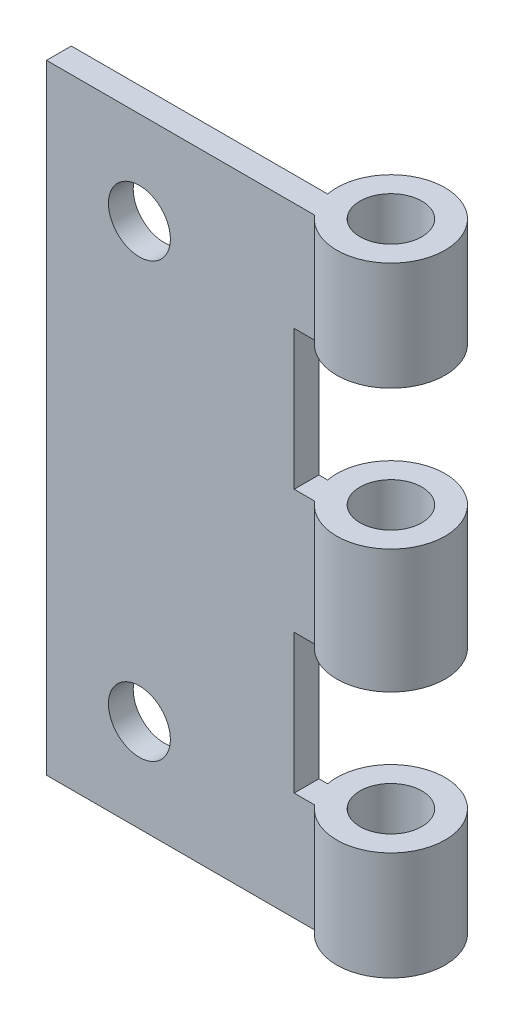
ISO-10303-21;
HEADER;
FILE_DESCRIPTION(('STEP AP214'),'2;1');
FILE_NAME('part.step','',(''),(''),'','','');
FILE_SCHEMA(('AUTOMOTIVE_DESIGN { 1 0 10303 214 1 1 1 1 }'));
ENDSEC;
DATA;
#1=APPLICATION_CONTEXT('core data for automotive mechanical design processes');
#2=APPLICATION_PROTOCOL_DEFINITION('international standard','automotive_design',2000,#1);
#3=PRODUCT_CONTEXT('',#1,'mechanical');
#4=PRODUCT('Part','Part','',(#3));
#5=PRODUCT_RELATED_PRODUCT_CATEGORY('part','',(#4));
#6=PRODUCT_DEFINITION_FORMATION('','',#4);
#7=PRODUCT_DEFINITION_CONTEXT('part definition',#1,'design');
#8=PRODUCT_DEFINITION('design','',#6,#7);
#9=PRODUCT_DEFINITION_SHAPE('','',#8);
#10=(LENGTH_UNIT() NAMED_UNIT(*) SI_UNIT(.MILLI.,.METRE.));
#11=(NAMED_UNIT(*) PLANE_ANGLE_UNIT() SI_UNIT($,.RADIAN.));
#12=(NAMED_UNIT(*) SI_UNIT($,.STERADIAN.) SOLID_ANGLE_UNIT());
#13=UNCERTAINTY_MEASURE_WITH_UNIT(LENGTH_MEASURE(1.E-05),#10,'distance_accuracy_value','');
#14=(GEOMETRIC_REPRESENTATION_CONTEXT(3) GLOBAL_UNCERTAINTY_ASSIGNED_CONTEXT((#13)) GLOBAL_UNIT_ASSIGNED_CONTEXT((#10,
#11,#12)) REPRESENTATION_CONTEXT('',''));
#15=CARTESIAN_POINT('',(0.,0.,0.));
#16=DIRECTION('',(0.,0.,1.));
#17=DIRECTION('',(1.,0.,0.));
#18=AXIS2_PLACEMENT_3D('',#15,#16,#17);
#19=CARTESIAN_POINT('',(25.4,50.8,-2.85750000000001));
#20=DIRECTION('',(0.,-1.,0.));
#21=DIRECTION('',(0.,0.,-1.));
#22=AXIS2_PLACEMENT_3D('',#19,#20,#21);
#23=CYLINDRICAL_SURFACE('',#22,4.44499999999999);
#24=CARTESIAN_POINT('',(25.4,30.48,-2.85750000000001));
#25=DIRECTION('',(0.,1.,0.));
#26=DIRECTION('',(0.,0.,1.));
#27=AXIS2_PLACEMENT_3D('',#24,#25,#26);
#28=CIRCLE('',#27,4.44499999999999);
#29=CARTESIAN_POINT('',(21.9951918189126,30.48,0.));
#30=VERTEX_POINT('',#29);
#31=CARTESIAN_POINT('',(21.0323261625895,30.48,-2.032));
#32=VERTEX_POINT('',#31);
#33=EDGE_CURVE('E50',#30,#32,#28,.T.);
#34=ORIENTED_EDGE('',*,*,#33,.F.);
#35=DIRECTION('',(0.,-1.,0.));
#36=VECTOR('',#35,1.);
#37=CARTESIAN_POINT('',(21.9951918189126,50.8,0.));
#38=LINE('',#37,#36);
#39=CARTESIAN_POINT('',(21.9951918189126,20.32,0.));
#40=VERTEX_POINT('',#39);
#41=EDGE_CURVE('E42',#30,#40,#38,.T.);
#42=ORIENTED_EDGE('',*,*,#41,.T.);
#43=CARTESIAN_POINT('',(25.4,20.32,-2.85750000000001));
#44=DIRECTION('',(0.,1.,0.));
#45=DIRECTION('',(0.,0.,1.));
#46=AXIS2_PLACEMENT_3D('',#43,#44,#45);
#47=CIRCLE('',#46,4.44499999999999);
#48=CARTESIAN_POINT('',(21.0323261625895,20.32,-2.032));
#49=VERTEX_POINT('',#48);
#50=EDGE_CURVE('E213',#40,#49,#47,.T.);
#51=ORIENTED_EDGE('',*,*,#50,.T.);
#52=DIRECTION('',(0.,-1.,0.));
#53=VECTOR('',#52,1.);
#54=CARTESIAN_POINT('',(21.0323261625895,50.8,-2.032));
#55=LINE('',#54,#53);
#56=EDGE_CURVE('E147',#32,#49,#55,.T.);
#57=ORIENTED_EDGE('',*,*,#56,.F.);
#58=EDGE_LOOP('',(#34,#42,#51,#57));
#59=FACE_BOUND('',#58,.T.);
#60=ADVANCED_FACE('F33',(#59),#23,.T.);
#61=CARTESIAN_POINT('',(25.4,8.89,-2.85750000000001));
#62=DIRECTION('',(0.,1.,0.));
#63=DIRECTION('',(0.,0.,1.));
#64=AXIS2_PLACEMENT_3D('',#61,#62,#63);
#65=CIRCLE('',#64,4.44499999999999);
#66=CARTESIAN_POINT('',(21.9951918189126,8.89,0.));
#67=VERTEX_POINT('',#66);
#68=CARTESIAN_POINT('',(21.0323261625895,8.89,-2.032));
#69=VERTEX_POINT('',#68);
#70=EDGE_CURVE('E58',#67,#69,#65,.T.);
#71=ORIENTED_EDGE('',*,*,#70,.F.);
#72=CARTESIAN_POINT('',(21.9951918189126,0.,0.));
#73=VERTEX_POINT('',#72);
#74=EDGE_CURVE('E43',#67,#73,#38,.T.);
#75=ORIENTED_EDGE('',*,*,#74,.T.);
#76=CARTESIAN_POINT('',(25.4,0.,-2.85750000000001));
#77=DIRECTION('',(0.,1.,0.));
#78=DIRECTION('',(0.,0.,1.));
#79=AXIS2_PLACEMENT_3D('',#76,#77,#78);
#80=CIRCLE('',#79,4.44499999999999);
#81=CARTESIAN_POINT('',(21.0323261625895,0.,-2.032));
#82=VERTEX_POINT('',#81);
#83=EDGE_CURVE('E169',#73,#82,#80,.T.);
#84=ORIENTED_EDGE('',*,*,#83,.T.);
#85=EDGE_CURVE('E149',#69,#82,#55,.T.);
#86=ORIENTED_EDGE('',*,*,#85,.F.);
#87=EDGE_LOOP('',(#71,#75,#84,#86));
#88=FACE_BOUND('',#87,.T.);
#89=ADVANCED_FACE('F268',(#88),#23,.T.);
#90=CARTESIAN_POINT('',(-9.0853298966291,50.8,0.));
#91=DIRECTION('',(0.,0.,-1.));
#92=DIRECTION('',(-1.,0.,0.));
#93=AXIS2_PLACEMENT_3D('',#90,#91,#92);
#94=PLANE('',#93);
#95=CARTESIAN_POINT('',(7.62,7.62,0.));
#96=DIRECTION('',(0.,0.,-1.));
#97=DIRECTION('',(-1.,0.,0.));
#98=AXIS2_PLACEMENT_3D('',#95,#96,#97);
#99=CIRCLE('',#98,2.54);
#100=CARTESIAN_POINT('',(5.08,7.62,0.));
#101=VERTEX_POINT('',#100);
#102=EDGE_CURVE('E186',#101,#101,#99,.T.);
#103=ORIENTED_EDGE('',*,*,#102,.T.);
#104=EDGE_LOOP('',(#103));
#105=FACE_BOUND('',#104,.T.);
#106=CARTESIAN_POINT('',(7.62,43.18,0.));
#107=DIRECTION('',(0.,0.,-1.));
#108=DIRECTION('',(-1.,0.,0.));
#109=AXIS2_PLACEMENT_3D('',#106,#107,#108);
#110=CIRCLE('',#109,2.54000000000001);
#111=CARTESIAN_POINT('',(5.07999999999999,43.18,0.));
#112=VERTEX_POINT('',#111);
#113=EDGE_CURVE('E174',#112,#112,#110,.T.);
#114=ORIENTED_EDGE('',*,*,#113,.T.);
#115=EDGE_LOOP('',(#114));
#116=FACE_BOUND('',#115,.T.);
#117=DIRECTION('',(0.,-1.,0.));
#118=VECTOR('',#117,1.);
#119=CARTESIAN_POINT('',(20.32,41.91,0.));
#120=LINE('',#119,#118);
#121=CARTESIAN_POINT('',(20.32,41.91,0.));
#122=VERTEX_POINT('',#121);
#123=CARTESIAN_POINT('',(20.32,30.48,0.));
#124=VERTEX_POINT('',#123);
#125=EDGE_CURVE('E219',#122,#124,#120,.T.);
#126=ORIENTED_EDGE('',*,*,#125,.F.);
#127=DIRECTION('',(1.,0.,0.));
#128=VECTOR('',#127,1.);
#129=CARTESIAN_POINT('',(-9.0853298966291,41.91,0.));
#130=LINE('',#129,#128);
#131=CARTESIAN_POINT('',(21.9951918189126,41.91,0.));
#132=VERTEX_POINT('',#131);
#133=EDGE_CURVE('E221',#122,#132,#130,.T.);
#134=ORIENTED_EDGE('',*,*,#133,.T.);
#135=CARTESIAN_POINT('',(21.9951918189126,50.8,0.));
#136=VERTEX_POINT('',#135);
#137=EDGE_CURVE('E11',#136,#132,#38,.T.);
#138=ORIENTED_EDGE('',*,*,#137,.F.);
#139=DIRECTION('',(1.,0.,0.));
#140=VECTOR('',#139,1.);
#141=CARTESIAN_POINT('',(-9.0853298966291,50.8,0.));
#142=LINE('',#141,#140);
#143=CARTESIAN_POINT('',(0.,50.8,0.));
#144=VERTEX_POINT('',#143);
#145=EDGE_CURVE('E165',#144,#136,#142,.T.);
#146=ORIENTED_EDGE('',*,*,#145,.F.);
#147=DIRECTION('',(0.,-1.,0.));
#148=VECTOR('',#147,1.);
#149=CARTESIAN_POINT('',(0.,50.8,0.));
#150=LINE('',#149,#148);
#151=CARTESIAN_POINT('',(0.,0.,0.));
#152=VERTEX_POINT('',#151);
#153=EDGE_CURVE('E155',#144,#152,#150,.T.);
#154=ORIENTED_EDGE('',*,*,#153,.T.);
#155=DIRECTION('',(1.,0.,0.));
#156=VECTOR('',#155,1.);
#157=CARTESIAN_POINT('',(-9.0853298966291,0.,0.));
#158=LINE('',#157,#156);
#159=EDGE_CURVE('E171',#152,#73,#158,.T.);
#160=ORIENTED_EDGE('',*,*,#159,.T.);
#161=ORIENTED_EDGE('',*,*,#74,.F.);
#162=DIRECTION('',(1.,0.,0.));
#163=VECTOR('',#162,1.);
#164=CARTESIAN_POINT('',(-9.0853298966291,8.89,0.));
#165=LINE('',#164,#163);
#166=CARTESIAN_POINT('',(20.32,8.89,0.));
#167=VERTEX_POINT('',#166);
#168=EDGE_CURVE('E205',#167,#67,#165,.T.);
#169=ORIENTED_EDGE('',*,*,#168,.F.);
#170=DIRECTION('',(0.,-1.,0.));
#171=VECTOR('',#170,1.);
#172=CARTESIAN_POINT('',(20.32,20.32,0.));
#173=LINE('',#172,#171);
#174=CARTESIAN_POINT('',(20.32,20.32,0.));
#175=VERTEX_POINT('',#174);
#176=EDGE_CURVE('E195',#175,#167,#173,.T.);
#177=ORIENTED_EDGE('',*,*,#176,.F.);
#178=DIRECTION('',(1.,0.,0.));
#179=VECTOR('',#178,1.);
#180=CARTESIAN_POINT('',(-9.0853298966291,20.32,0.));
#181=LINE('',#180,#179);
#182=EDGE_CURVE('E201',#175,#40,#181,.T.);
#183=ORIENTED_EDGE('',*,*,#182,.T.);
#184=ORIENTED_EDGE('',*,*,#41,.F.);
#185=DIRECTION('',(1.,0.,0.));
#186=VECTOR('',#185,1.);
#187=CARTESIAN_POINT('',(-9.0853298966291,30.48,0.));
#188=LINE('',#187,#186);
#189=EDGE_CURVE('E141',#124,#30,#188,.T.);
#190=ORIENTED_EDGE('',*,*,#189,.F.);
#191=EDGE_LOOP('',(#126,#134,#138,#146,#154,#160,#161,#169,#177,#183,#184,#190));
#192=FACE_BOUND('',#191,.T.);
#193=ADVANCED_FACE('F35',(#105,#116,#192),#94,.F.);
#194=ORIENTED_EDGE('',*,*,#137,.T.);
#195=CARTESIAN_POINT('',(25.4,41.91,-2.85750000000001));
#196=DIRECTION('',(0.,1.,0.));
#197=DIRECTION('',(0.,0.,1.));
#198=AXIS2_PLACEMENT_3D('',#195,#196,#197);
#199=CIRCLE('',#198,4.44499999999999);
#200=CARTESIAN_POINT('',(21.0323261625895,41.91,-2.032));
#201=VERTEX_POINT('',#200);
#202=EDGE_CURVE('E127',#132,#201,#199,.T.);
#203=ORIENTED_EDGE('',*,*,#202,.T.);
#204=CARTESIAN_POINT('',(21.0323261625895,50.8,-2.032));
#205=VERTEX_POINT('',#204);
#206=EDGE_CURVE('E138',#205,#201,#55,.T.);
#207=ORIENTED_EDGE('',*,*,#206,.F.);
#208=CARTESIAN_POINT('',(25.4,50.8,-2.85750000000001));
#209=DIRECTION('',(0.,1.,0.));
#210=DIRECTION('',(0.,0.,1.));
#211=AXIS2_PLACEMENT_3D('',#208,#209,#210);
#212=CIRCLE('',#211,4.44499999999999);
#213=EDGE_CURVE('E177',#136,#205,#212,.T.);
#214=ORIENTED_EDGE('',*,*,#213,.F.);
#215=EDGE_LOOP('',(#194,#203,#207,#214));
#216=FACE_BOUND('',#215,.T.);
#217=ADVANCED_FACE('F137',(#216),#23,.T.);
#218=CARTESIAN_POINT('',(-9.0853298966291,50.8,-2.032));
#219=DIRECTION('',(0.,0.,-1.));
#220=DIRECTION('',(-1.,0.,0.));
#221=AXIS2_PLACEMENT_3D('',#218,#219,#220);
#222=PLANE('',#221);
#223=DIRECTION('',(1.,0.,0.));
#224=VECTOR('',#223,1.);
#225=CARTESIAN_POINT('',(-9.0853298966291,41.91,-2.032));
#226=LINE('',#225,#224);
#227=CARTESIAN_POINT('',(20.32,41.91,-2.032));
#228=VERTEX_POINT('',#227);
#229=EDGE_CURVE('E124',#228,#201,#226,.T.);
#230=ORIENTED_EDGE('',*,*,#229,.F.);
#231=DIRECTION('',(0.,-1.,0.));
#232=VECTOR('',#231,1.);
#233=CARTESIAN_POINT('',(20.32,41.91,-2.032));
#234=LINE('',#233,#232);
#235=CARTESIAN_POINT('',(20.32,30.48,-2.032));
#236=VERTEX_POINT('',#235);
#237=EDGE_CURVE('E207',#228,#236,#234,.T.);
#238=ORIENTED_EDGE('',*,*,#237,.T.);
#239=DIRECTION('',(1.,0.,0.));
#240=VECTOR('',#239,1.);
#241=CARTESIAN_POINT('',(-9.0853298966291,30.48,-2.032));
#242=LINE('',#241,#240);
#243=EDGE_CURVE('E226',#236,#32,#242,.T.);
#244=ORIENTED_EDGE('',*,*,#243,.T.);
#245=ORIENTED_EDGE('',*,*,#56,.T.);
#246=DIRECTION('',(1.,0.,0.));
#247=VECTOR('',#246,1.);
#248=CARTESIAN_POINT('',(-9.0853298966291,20.32,-2.032));
#249=LINE('',#248,#247);
#250=CARTESIAN_POINT('',(20.32,20.32,-2.032));
#251=VERTEX_POINT('',#250);
#252=EDGE_CURVE('E210',#251,#49,#249,.T.);
#253=ORIENTED_EDGE('',*,*,#252,.F.);
#254=DIRECTION('',(0.,-1.,0.));
#255=VECTOR('',#254,1.);
#256=CARTESIAN_POINT('',(20.32,20.32,-2.032));
#257=LINE('',#256,#255);
#258=CARTESIAN_POINT('',(20.32,8.89,-2.032));
#259=VERTEX_POINT('',#258);
#260=EDGE_CURVE('E192',#251,#259,#257,.T.);
#261=ORIENTED_EDGE('',*,*,#260,.T.);
#262=DIRECTION('',(1.,0.,0.));
#263=VECTOR('',#262,1.);
#264=CARTESIAN_POINT('',(-9.0853298966291,8.89,-2.032));
#265=LINE('',#264,#263);
#266=EDGE_CURVE('E202',#259,#69,#265,.T.);
#267=ORIENTED_EDGE('',*,*,#266,.T.);
#268=ORIENTED_EDGE('',*,*,#85,.T.);
#269=DIRECTION('',(1.,0.,0.));
#270=VECTOR('',#269,1.);
#271=CARTESIAN_POINT('',(-9.0853298966291,0.,-2.032));
#272=LINE('',#271,#270);
#273=CARTESIAN_POINT('',(0.,0.,-2.032));
#274=VERTEX_POINT('',#273);
#275=EDGE_CURVE('E166',#274,#82,#272,.T.);
#276=ORIENTED_EDGE('',*,*,#275,.F.);
#277=DIRECTION('',(0.,-1.,0.));
#278=VECTOR('',#277,1.);
#279=CARTESIAN_POINT('',(0.,50.8,-2.032));
#280=LINE('',#279,#278);
#281=CARTESIAN_POINT('',(0.,50.8,-2.032));
#282=VERTEX_POINT('',#281);
#283=EDGE_CURVE('E151',#282,#274,#280,.T.);
#284=ORIENTED_EDGE('',*,*,#283,.F.);
#285=DIRECTION('',(1.,0.,0.));
#286=VECTOR('',#285,1.);
#287=CARTESIAN_POINT('',(-9.0853298966291,50.8,-2.032));
#288=LINE('',#287,#286);
#289=EDGE_CURVE('E146',#282,#205,#288,.T.);
#290=ORIENTED_EDGE('',*,*,#289,.T.);
#291=ORIENTED_EDGE('',*,*,#206,.T.);
#292=EDGE_LOOP('',(#230,#238,#244,#245,#253,#261,#267,#268,#276,#284,#290,#291));
#293=FACE_BOUND('',#292,.T.);
#294=CARTESIAN_POINT('',(7.62,7.62,-2.032));
#295=DIRECTION('',(0.,0.,-1.));
#296=DIRECTION('',(-1.,0.,0.));
#297=AXIS2_PLACEMENT_3D('',#294,#295,#296);
#298=CIRCLE('',#297,2.54);
#299=CARTESIAN_POINT('',(5.08,7.62,-2.032));
#300=VERTEX_POINT('',#299);
#301=EDGE_CURVE('E189',#300,#300,#298,.T.);
#302=ORIENTED_EDGE('',*,*,#301,.F.);
#303=EDGE_LOOP('',(#302));
#304=FACE_BOUND('',#303,.T.);
#305=CARTESIAN_POINT('',(7.62,43.18,-2.032));
#306=DIRECTION('',(0.,0.,-1.));
#307=DIRECTION('',(-1.,0.,0.));
#308=AXIS2_PLACEMENT_3D('',#305,#306,#307);
#309=CIRCLE('',#308,2.54000000000001);
#310=CARTESIAN_POINT('',(5.07999999999999,43.18,-2.032));
#311=VERTEX_POINT('',#310);
#312=EDGE_CURVE('E183',#311,#311,#309,.T.);
#313=ORIENTED_EDGE('',*,*,#312,.F.);
#314=EDGE_LOOP('',(#313));
#315=FACE_BOUND('',#314,.T.);
#316=ADVANCED_FACE('F143',(#293,#304,#315),#222,.T.);
#317=CARTESIAN_POINT('',(0.,50.8,-1.60470923574486));
#318=DIRECTION('',(-1.,0.,0.));
#319=DIRECTION('',(0.,0.,1.));
#320=AXIS2_PLACEMENT_3D('',#317,#318,#319);
#321=PLANE('',#320);
#322=DIRECTION('',(0.,0.,-1.));
#323=VECTOR('',#322,1.);
#324=CARTESIAN_POINT('',(0.,0.,-1.60470923574486));
#325=LINE('',#324,#323);
#326=EDGE_CURVE('E162',#152,#274,#325,.T.);
#327=ORIENTED_EDGE('',*,*,#326,.F.);
#328=ORIENTED_EDGE('',*,*,#153,.F.);
#329=DIRECTION('',(0.,0.,-1.));
#330=VECTOR('',#329,1.);
#331=CARTESIAN_POINT('',(0.,50.8,-1.60470923574486));
#332=LINE('',#331,#330);
#333=EDGE_CURVE('E159',#144,#282,#332,.T.);
#334=ORIENTED_EDGE('',*,*,#333,.T.);
#335=ORIENTED_EDGE('',*,*,#283,.T.);
#336=EDGE_LOOP('',(#327,#328,#334,#335));
#337=FACE_BOUND('',#336,.T.);
#338=ADVANCED_FACE('F280',(#337),#321,.T.);
#339=CARTESIAN_POINT('',(-9.0853298966291,50.8,-1.60470923574486));
#340=DIRECTION('',(0.,1.,0.));
#341=DIRECTION('',(0.,0.,1.));
#342=AXIS2_PLACEMENT_3D('',#339,#340,#341);
#343=PLANE('',#342);
#344=CARTESIAN_POINT('',(25.4,50.8,-2.85750000000001));
#345=DIRECTION('',(0.,1.,0.));
#346=DIRECTION('',(0.,0.,1.));
#347=AXIS2_PLACEMENT_3D('',#344,#345,#346);
#348=CIRCLE('',#347,2.54);
#349=CARTESIAN_POINT('',(25.4,50.8,-0.31750000000001));
#350=VERTEX_POINT('',#349);
#351=EDGE_CURVE('E240',#350,#350,#348,.T.);
#352=ORIENTED_EDGE('',*,*,#351,.F.);
#353=EDGE_LOOP('',(#352));
#354=FACE_BOUND('',#353,.T.);
#355=ORIENTED_EDGE('',*,*,#145,.T.);
#356=ORIENTED_EDGE('',*,*,#213,.T.);
#357=ORIENTED_EDGE('',*,*,#289,.F.);
#358=ORIENTED_EDGE('',*,*,#333,.F.);
#359=EDGE_LOOP('',(#355,#356,#357,#358));
#360=FACE_BOUND('',#359,.T.);
#361=ADVANCED_FACE('F312',(#354,#360),#343,.T.);
#362=CARTESIAN_POINT('',(-9.0853298966291,0.,-1.60470923574486));
#363=DIRECTION('',(0.,1.,0.));
#364=DIRECTION('',(0.,0.,1.));
#365=AXIS2_PLACEMENT_3D('',#362,#363,#364);
#366=PLANE('',#365);
#367=CARTESIAN_POINT('',(25.4,0.,-2.85750000000001));
#368=DIRECTION('',(0.,1.,0.));
#369=DIRECTION('',(0.,0.,1.));
#370=AXIS2_PLACEMENT_3D('',#367,#368,#369);
#371=CIRCLE('',#370,2.54);
#372=CARTESIAN_POINT('',(25.4,0.,-0.31750000000001));
#373=VERTEX_POINT('',#372);
#374=EDGE_CURVE('E243',#373,#373,#371,.T.);
#375=ORIENTED_EDGE('',*,*,#374,.T.);
#376=EDGE_LOOP('',(#375));
#377=FACE_BOUND('',#376,.T.);
#378=ORIENTED_EDGE('',*,*,#159,.F.);
#379=ORIENTED_EDGE('',*,*,#326,.T.);
#380=ORIENTED_EDGE('',*,*,#275,.T.);
#381=ORIENTED_EDGE('',*,*,#83,.F.);
#382=EDGE_LOOP('',(#378,#379,#380,#381));
#383=FACE_BOUND('',#382,.T.);
#384=ADVANCED_FACE('F309',(#377,#383),#366,.F.);
#385=CARTESIAN_POINT('',(7.62,43.18,48.768));
#386=DIRECTION('',(0.,0.,-1.));
#387=DIRECTION('',(-1.,0.,0.));
#388=AXIS2_PLACEMENT_3D('',#385,#386,#387);
#389=CYLINDRICAL_SURFACE('',#388,2.54000000000001);
#390=ORIENTED_EDGE('',*,*,#312,.T.);
#391=EDGE_LOOP('',(#390));
#392=FACE_BOUND('',#391,.T.);
#393=ORIENTED_EDGE('',*,*,#113,.F.);
#394=EDGE_LOOP('',(#393));
#395=FACE_BOUND('',#394,.T.);
#396=ADVANCED_FACE('F323',(#392,#395),#389,.F.);
#397=CARTESIAN_POINT('',(7.62,7.62,48.768));
#398=DIRECTION('',(0.,0.,-1.));
#399=DIRECTION('',(-1.,0.,0.));
#400=AXIS2_PLACEMENT_3D('',#397,#398,#399);
#401=CYLINDRICAL_SURFACE('',#400,2.54);
#402=ORIENTED_EDGE('',*,*,#301,.T.);
#403=EDGE_LOOP('',(#402));
#404=FACE_BOUND('',#403,.T.);
#405=ORIENTED_EDGE('',*,*,#102,.F.);
#406=EDGE_LOOP('',(#405));
#407=FACE_BOUND('',#406,.T.);
#408=ADVANCED_FACE('F327',(#404,#407),#401,.F.);
#409=CARTESIAN_POINT('',(20.32,20.32,-1.60470923574486));
#410=DIRECTION('',(-1.,0.,0.));
#411=DIRECTION('',(0.,0.,1.));
#412=AXIS2_PLACEMENT_3D('',#409,#410,#411);
#413=PLANE('',#412);
#414=DIRECTION('',(0.,0.,-1.));
#415=VECTOR('',#414,1.);
#416=CARTESIAN_POINT('',(20.32,8.89,-1.60470923574486));
#417=LINE('',#416,#415);
#418=EDGE_CURVE('E198',#167,#259,#417,.T.);
#419=ORIENTED_EDGE('',*,*,#418,.T.);
#420=ORIENTED_EDGE('',*,*,#260,.F.);
#421=DIRECTION('',(0.,0.,-1.));
#422=VECTOR('',#421,1.);
#423=CARTESIAN_POINT('',(20.32,20.32,-1.60470923574486));
#424=LINE('',#423,#422);
#425=EDGE_CURVE('E197',#175,#251,#424,.T.);
#426=ORIENTED_EDGE('',*,*,#425,.F.);
#427=ORIENTED_EDGE('',*,*,#176,.T.);
#428=EDGE_LOOP('',(#419,#420,#426,#427));
#429=FACE_BOUND('',#428,.T.);
#430=ADVANCED_FACE('F304',(#429),#413,.F.);
#431=CARTESIAN_POINT('',(-9.0853298966291,20.32,-1.60470923574486));
#432=DIRECTION('',(0.,1.,0.));
#433=DIRECTION('',(0.,0.,1.));
#434=AXIS2_PLACEMENT_3D('',#431,#432,#433);
#435=PLANE('',#434);
#436=CARTESIAN_POINT('',(25.4,20.32,-2.85750000000001));
#437=DIRECTION('',(0.,1.,0.));
#438=DIRECTION('',(0.,0.,1.));
#439=AXIS2_PLACEMENT_3D('',#436,#437,#438);
#440=CIRCLE('',#439,2.54);
#441=CARTESIAN_POINT('',(25.4,20.32,-0.31750000000001));
#442=VERTEX_POINT('',#441);
#443=EDGE_CURVE('E229',#442,#442,#440,.T.);
#444=ORIENTED_EDGE('',*,*,#443,.T.);
#445=EDGE_LOOP('',(#444));
#446=FACE_BOUND('',#445,.T.);
#447=ORIENTED_EDGE('',*,*,#182,.F.);
#448=ORIENTED_EDGE('',*,*,#425,.T.);
#449=ORIENTED_EDGE('',*,*,#252,.T.);
#450=ORIENTED_EDGE('',*,*,#50,.F.);
#451=EDGE_LOOP('',(#447,#448,#449,#450));
#452=FACE_BOUND('',#451,.T.);
#453=ADVANCED_FACE('F297',(#446,#452),#435,.F.);
#454=CARTESIAN_POINT('',(-9.0853298966291,8.89,-1.60470923574486));
#455=DIRECTION('',(0.,1.,0.));
#456=DIRECTION('',(0.,0.,1.));
#457=AXIS2_PLACEMENT_3D('',#454,#455,#456);
#458=PLANE('',#457);
#459=CARTESIAN_POINT('',(25.4,8.89,-2.85750000000001));
#460=DIRECTION('',(0.,1.,0.));
#461=DIRECTION('',(0.,0.,1.));
#462=AXIS2_PLACEMENT_3D('',#459,#460,#461);
#463=CIRCLE('',#462,2.54);
#464=CARTESIAN_POINT('',(25.4,8.89,-0.31750000000001));
#465=VERTEX_POINT('',#464);
#466=EDGE_CURVE('E234',#465,#465,#463,.T.);
#467=ORIENTED_EDGE('',*,*,#466,.F.);
#468=EDGE_LOOP('',(#467));
#469=FACE_BOUND('',#468,.T.);
#470=ORIENTED_EDGE('',*,*,#168,.T.);
#471=ORIENTED_EDGE('',*,*,#70,.T.);
#472=ORIENTED_EDGE('',*,*,#266,.F.);
#473=ORIENTED_EDGE('',*,*,#418,.F.);
#474=EDGE_LOOP('',(#470,#471,#472,#473));
#475=FACE_BOUND('',#474,.T.);
#476=ADVANCED_FACE('F305',(#469,#475),#458,.T.);
#477=CARTESIAN_POINT('',(20.32,41.91,-1.60470923574486));
#478=DIRECTION('',(-1.,0.,0.));
#479=DIRECTION('',(0.,0.,1.));
#480=AXIS2_PLACEMENT_3D('',#477,#478,#479);
#481=PLANE('',#480);
#482=DIRECTION('',(0.,0.,-1.));
#483=VECTOR('',#482,1.);
#484=CARTESIAN_POINT('',(20.32,30.48,-1.60470923574486));
#485=LINE('',#484,#483);
#486=EDGE_CURVE('E223',#124,#236,#485,.T.);
#487=ORIENTED_EDGE('',*,*,#486,.T.);
#488=ORIENTED_EDGE('',*,*,#237,.F.);
#489=DIRECTION('',(0.,0.,-1.));
#490=VECTOR('',#489,1.);
#491=CARTESIAN_POINT('',(20.32,41.91,-1.60470923574486));
#492=LINE('',#491,#490);
#493=EDGE_CURVE('E130',#122,#228,#492,.T.);
#494=ORIENTED_EDGE('',*,*,#493,.F.);
#495=ORIENTED_EDGE('',*,*,#125,.T.);
#496=EDGE_LOOP('',(#487,#488,#494,#495));
#497=FACE_BOUND('',#496,.T.);
#498=ADVANCED_FACE('F263',(#497),#481,.F.);
#499=CARTESIAN_POINT('',(-9.0853298966291,41.91,-1.60470923574486));
#500=DIRECTION('',(0.,1.,0.));
#501=DIRECTION('',(0.,0.,1.));
#502=AXIS2_PLACEMENT_3D('',#499,#500,#501);
#503=PLANE('',#502);
#504=CARTESIAN_POINT('',(25.4,41.91,-2.85750000000001));
#505=DIRECTION('',(0.,1.,0.));
#506=DIRECTION('',(0.,0.,1.));
#507=AXIS2_PLACEMENT_3D('',#504,#505,#506);
#508=CIRCLE('',#507,2.54);
#509=CARTESIAN_POINT('',(25.4,41.91,-0.31750000000001));
#510=VERTEX_POINT('',#509);
#511=EDGE_CURVE('E237',#510,#510,#508,.T.);
#512=ORIENTED_EDGE('',*,*,#511,.T.);
#513=EDGE_LOOP('',(#512));
#514=FACE_BOUND('',#513,.T.);
#515=ORIENTED_EDGE('',*,*,#202,.F.);
#516=ORIENTED_EDGE('',*,*,#133,.F.);
#517=ORIENTED_EDGE('',*,*,#493,.T.);
#518=ORIENTED_EDGE('',*,*,#229,.T.);
#519=EDGE_LOOP('',(#515,#516,#517,#518));
#520=FACE_BOUND('',#519,.T.);
#521=ADVANCED_FACE('F126',(#514,#520),#503,.F.);
#522=CARTESIAN_POINT('',(-9.0853298966291,30.48,-1.60470923574486));
#523=DIRECTION('',(0.,1.,0.));
#524=DIRECTION('',(0.,0.,1.));
#525=AXIS2_PLACEMENT_3D('',#522,#523,#524);
#526=PLANE('',#525);
#527=CARTESIAN_POINT('',(25.4,30.48,-2.85750000000001));
#528=DIRECTION('',(0.,1.,0.));
#529=DIRECTION('',(0.,0.,1.));
#530=AXIS2_PLACEMENT_3D('',#527,#528,#529);
#531=CIRCLE('',#530,2.54);
#532=CARTESIAN_POINT('',(25.4,30.48,-0.31750000000001));
#533=VERTEX_POINT('',#532);
#534=EDGE_CURVE('E37',#533,#533,#531,.T.);
#535=ORIENTED_EDGE('',*,*,#534,.F.);
#536=EDGE_LOOP('',(#535));
#537=FACE_BOUND('',#536,.T.);
#538=ORIENTED_EDGE('',*,*,#33,.T.);
#539=ORIENTED_EDGE('',*,*,#243,.F.);
#540=ORIENTED_EDGE('',*,*,#486,.F.);
#541=ORIENTED_EDGE('',*,*,#189,.T.);
#542=EDGE_LOOP('',(#538,#539,#540,#541));
#543=FACE_BOUND('',#542,.T.);
#544=ADVANCED_FACE('F253',(#537,#543),#526,.T.);
#545=CARTESIAN_POINT('',(25.4,0.,-2.85750000000001));
#546=DIRECTION('',(0.,1.,0.));
#547=DIRECTION('',(0.,0.,1.));
#548=AXIS2_PLACEMENT_3D('',#545,#546,#547);
#549=CYLINDRICAL_SURFACE('',#548,2.54);
#550=ORIENTED_EDGE('',*,*,#534,.T.);
#551=EDGE_LOOP('',(#550));
#552=FACE_BOUND('',#551,.T.);
#553=ORIENTED_EDGE('',*,*,#443,.F.);
#554=EDGE_LOOP('',(#553));
#555=FACE_BOUND('',#554,.T.);
#556=ADVANCED_FACE('F250',(#552,#555),#549,.F.);
#557=ORIENTED_EDGE('',*,*,#351,.T.);
#558=EDGE_LOOP('',(#557));
#559=FACE_BOUND('',#558,.T.);
#560=ORIENTED_EDGE('',*,*,#511,.F.);
#561=EDGE_LOOP('',(#560));
#562=FACE_BOUND('',#561,.T.);
#563=ADVANCED_FACE('F260',(#559,#562),#549,.F.);
#564=ORIENTED_EDGE('',*,*,#466,.T.);
#565=EDGE_LOOP('',(#564));
#566=FACE_BOUND('',#565,.T.);
#567=ORIENTED_EDGE('',*,*,#374,.F.);
#568=EDGE_LOOP('',(#567));
#569=FACE_BOUND('',#568,.T.);
#570=ADVANCED_FACE('F262',(#566,#569),#549,.F.);
#571=CLOSED_SHELL('',(#60,#89,#193,#217,#316,#338,#361,#384,#396,#408,#430,#453,#476,#498,#521,
#544,#556,#563,#570));
#572=MANIFOLD_SOLID_BREP('B2',#571);
#573=ADVANCED_BREP_SHAPE_REPRESENTATION('',(#18,#572),#14);
#574=SHAPE_DEFINITION_REPRESENTATION(#9,#573);
ENDSEC;
END-ISO-10303-21;
